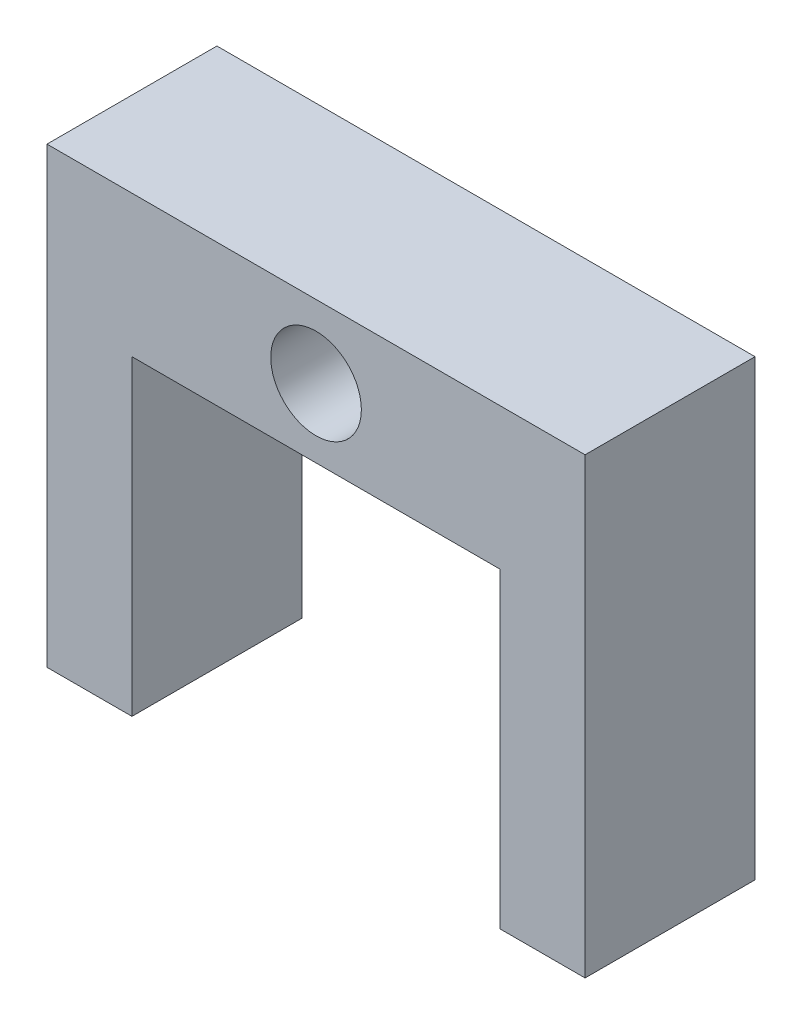
ISO-10303-21;
HEADER;
FILE_DESCRIPTION(('STEP AP214'),'2;1');
FILE_NAME('part.step','',(''),(''),'','','');
FILE_SCHEMA(('AUTOMOTIVE_DESIGN { 1 0 10303 214 1 1 1 1 }'));
ENDSEC;
DATA;
#1=APPLICATION_CONTEXT('core data for automotive mechanical design processes');
#2=APPLICATION_PROTOCOL_DEFINITION('international standard','automotive_design',2000,#1);
#3=PRODUCT_CONTEXT('',#1,'mechanical');
#4=PRODUCT('Part','Part','',(#3));
#5=PRODUCT_RELATED_PRODUCT_CATEGORY('part','',(#4));
#6=PRODUCT_DEFINITION_FORMATION('','',#4);
#7=PRODUCT_DEFINITION_CONTEXT('part definition',#1,'design');
#8=PRODUCT_DEFINITION('design','',#6,#7);
#9=PRODUCT_DEFINITION_SHAPE('','',#8);
#10=(LENGTH_UNIT() NAMED_UNIT(*) SI_UNIT(.MILLI.,.METRE.));
#11=(NAMED_UNIT(*) PLANE_ANGLE_UNIT() SI_UNIT($,.RADIAN.));
#12=(NAMED_UNIT(*) SI_UNIT($,.STERADIAN.) SOLID_ANGLE_UNIT());
#13=UNCERTAINTY_MEASURE_WITH_UNIT(LENGTH_MEASURE(1.E-05),#10,'distance_accuracy_value','');
#14=(GEOMETRIC_REPRESENTATION_CONTEXT(3) GLOBAL_UNCERTAINTY_ASSIGNED_CONTEXT((#13)) GLOBAL_UNIT_ASSIGNED_CONTEXT((#10,
#11,#12)) REPRESENTATION_CONTEXT('',''));
#15=CARTESIAN_POINT('',(0.,0.,0.));
#16=DIRECTION('',(0.,0.,1.));
#17=DIRECTION('',(1.,0.,0.));
#18=AXIS2_PLACEMENT_3D('',#15,#16,#17);
#19=CARTESIAN_POINT('',(0.,0.,6.));
#20=DIRECTION('',(0.,0.,-1.));
#21=DIRECTION('',(-1.,0.,0.));
#22=AXIS2_PLACEMENT_3D('',#19,#20,#21);
#23=PLANE('',#22);
#24=DIRECTION('',(0.,-1.,0.));
#25=VECTOR('',#24,1.);
#26=CARTESIAN_POINT('',(0.,0.,6.));
#27=LINE('',#26,#25);
#28=CARTESIAN_POINT('',(0.,16.,6.));
#29=VERTEX_POINT('',#28);
#30=CARTESIAN_POINT('',(0.,0.,6.));
#31=VERTEX_POINT('',#30);
#32=EDGE_CURVE('E147',#29,#31,#27,.T.);
#33=ORIENTED_EDGE('',*,*,#32,.T.);
#34=DIRECTION('',(1.,0.,0.));
#35=VECTOR('',#34,1.);
#36=CARTESIAN_POINT('',(0.,0.,6.));
#37=LINE('',#36,#35);
#38=CARTESIAN_POINT('',(3.,0.,6.));
#39=VERTEX_POINT('',#38);
#40=EDGE_CURVE('E95',#31,#39,#37,.T.);
#41=ORIENTED_EDGE('',*,*,#40,.T.);
#42=DIRECTION('',(0.,1.,0.));
#43=VECTOR('',#42,1.);
#44=CARTESIAN_POINT('',(3.,0.,6.));
#45=LINE('',#44,#43);
#46=CARTESIAN_POINT('',(3.,11.,6.));
#47=VERTEX_POINT('',#46);
#48=EDGE_CURVE('E162',#39,#47,#45,.T.);
#49=ORIENTED_EDGE('',*,*,#48,.T.);
#50=DIRECTION('',(1.,0.,0.));
#51=VECTOR('',#50,1.);
#52=CARTESIAN_POINT('',(3.,11.,6.));
#53=LINE('',#52,#51);
#54=CARTESIAN_POINT('',(16.,11.,6.));
#55=VERTEX_POINT('',#54);
#56=EDGE_CURVE('E175',#47,#55,#53,.T.);
#57=ORIENTED_EDGE('',*,*,#56,.T.);
#58=DIRECTION('',(0.,-1.,0.));
#59=VECTOR('',#58,1.);
#60=CARTESIAN_POINT('',(16.,0.,6.));
#61=LINE('',#60,#59);
#62=CARTESIAN_POINT('',(16.,0.,6.));
#63=VERTEX_POINT('',#62);
#64=EDGE_CURVE('E114',#55,#63,#61,.T.);
#65=ORIENTED_EDGE('',*,*,#64,.T.);
#66=DIRECTION('',(1.,0.,0.));
#67=VECTOR('',#66,1.);
#68=CARTESIAN_POINT('',(16.,0.,6.));
#69=LINE('',#68,#67);
#70=CARTESIAN_POINT('',(19.,0.,6.));
#71=VERTEX_POINT('',#70);
#72=EDGE_CURVE('E108',#63,#71,#69,.T.);
#73=ORIENTED_EDGE('',*,*,#72,.T.);
#74=DIRECTION('',(0.,1.,0.));
#75=VECTOR('',#74,1.);
#76=CARTESIAN_POINT('',(19.,0.,6.));
#77=LINE('',#76,#75);
#78=CARTESIAN_POINT('',(19.,16.,6.));
#79=VERTEX_POINT('',#78);
#80=EDGE_CURVE('E112',#71,#79,#77,.T.);
#81=ORIENTED_EDGE('',*,*,#80,.T.);
#82=DIRECTION('',(-1.,0.,0.));
#83=VECTOR('',#82,1.);
#84=CARTESIAN_POINT('',(0.,16.,6.));
#85=LINE('',#84,#83);
#86=EDGE_CURVE('E52',#79,#29,#85,.T.);
#87=ORIENTED_EDGE('',*,*,#86,.T.);
#88=EDGE_LOOP('',(#33,#41,#49,#57,#65,#73,#81,#87));
#89=FACE_BOUND('',#88,.T.);
#90=CARTESIAN_POINT('',(9.5,13.4307299658215,6.));
#91=DIRECTION('',(0.,0.,1.));
#92=DIRECTION('',(1.,0.,0.));
#93=AXIS2_PLACEMENT_3D('',#90,#91,#92);
#94=CIRCLE('',#93,1.6);
#95=CARTESIAN_POINT('',(11.1,13.4307299658215,6.));
#96=VERTEX_POINT('',#95);
#97=EDGE_CURVE('E136',#96,#96,#94,.T.);
#98=ORIENTED_EDGE('',*,*,#97,.F.);
#99=EDGE_LOOP('',(#98));
#100=FACE_BOUND('',#99,.T.);
#101=ADVANCED_FACE('F35',(#89,#100),#23,.F.);
#102=CARTESIAN_POINT('',(0.,0.,0.));
#103=DIRECTION('',(0.,0.,-1.));
#104=DIRECTION('',(-1.,0.,0.));
#105=AXIS2_PLACEMENT_3D('',#102,#103,#104);
#106=PLANE('',#105);
#107=DIRECTION('',(0.,-1.,0.));
#108=VECTOR('',#107,1.);
#109=CARTESIAN_POINT('',(0.,0.,0.));
#110=LINE('',#109,#108);
#111=CARTESIAN_POINT('',(0.,16.,0.));
#112=VERTEX_POINT('',#111);
#113=CARTESIAN_POINT('',(0.,0.,0.));
#114=VERTEX_POINT('',#113);
#115=EDGE_CURVE('E132',#112,#114,#110,.T.);
#116=ORIENTED_EDGE('',*,*,#115,.F.);
#117=DIRECTION('',(-1.,0.,0.));
#118=VECTOR('',#117,1.);
#119=CARTESIAN_POINT('',(0.,16.,0.));
#120=LINE('',#119,#118);
#121=CARTESIAN_POINT('',(19.,16.,0.));
#122=VERTEX_POINT('',#121);
#123=EDGE_CURVE('E87',#122,#112,#120,.T.);
#124=ORIENTED_EDGE('',*,*,#123,.F.);
#125=DIRECTION('',(0.,1.,0.));
#126=VECTOR('',#125,1.);
#127=CARTESIAN_POINT('',(19.,0.,0.));
#128=LINE('',#127,#126);
#129=CARTESIAN_POINT('',(19.,0.,0.));
#130=VERTEX_POINT('',#129);
#131=EDGE_CURVE('E81',#130,#122,#128,.T.);
#132=ORIENTED_EDGE('',*,*,#131,.F.);
#133=DIRECTION('',(1.,0.,0.));
#134=VECTOR('',#133,1.);
#135=CARTESIAN_POINT('',(16.,0.,0.));
#136=LINE('',#135,#134);
#137=CARTESIAN_POINT('',(16.,0.,0.));
#138=VERTEX_POINT('',#137);
#139=EDGE_CURVE('E122',#138,#130,#136,.T.);
#140=ORIENTED_EDGE('',*,*,#139,.F.);
#141=DIRECTION('',(0.,-1.,0.));
#142=VECTOR('',#141,1.);
#143=CARTESIAN_POINT('',(16.,0.,0.));
#144=LINE('',#143,#142);
#145=CARTESIAN_POINT('',(16.,11.,0.));
#146=VERTEX_POINT('',#145);
#147=EDGE_CURVE('E142',#146,#138,#144,.T.);
#148=ORIENTED_EDGE('',*,*,#147,.F.);
#149=DIRECTION('',(1.,0.,0.));
#150=VECTOR('',#149,1.);
#151=CARTESIAN_POINT('',(3.,11.,0.));
#152=LINE('',#151,#150);
#153=CARTESIAN_POINT('',(3.,11.,0.));
#154=VERTEX_POINT('',#153);
#155=EDGE_CURVE('E140',#154,#146,#152,.T.);
#156=ORIENTED_EDGE('',*,*,#155,.F.);
#157=DIRECTION('',(0.,1.,0.));
#158=VECTOR('',#157,1.);
#159=CARTESIAN_POINT('',(3.,0.,0.));
#160=LINE('',#159,#158);
#161=CARTESIAN_POINT('',(3.,0.,0.));
#162=VERTEX_POINT('',#161);
#163=EDGE_CURVE('E138',#162,#154,#160,.T.);
#164=ORIENTED_EDGE('',*,*,#163,.F.);
#165=DIRECTION('',(1.,0.,0.));
#166=VECTOR('',#165,1.);
#167=CARTESIAN_POINT('',(0.,0.,0.));
#168=LINE('',#167,#166);
#169=EDGE_CURVE('E135',#114,#162,#168,.T.);
#170=ORIENTED_EDGE('',*,*,#169,.F.);
#171=EDGE_LOOP('',(#116,#124,#132,#140,#148,#156,#164,#170));
#172=FACE_BOUND('',#171,.T.);
#173=CARTESIAN_POINT('',(9.5,13.4307299658215,0.));
#174=DIRECTION('',(0.,0.,1.));
#175=DIRECTION('',(1.,0.,0.));
#176=AXIS2_PLACEMENT_3D('',#173,#174,#175);
#177=CIRCLE('',#176,1.6);
#178=CARTESIAN_POINT('',(11.1,13.4307299658215,0.));
#179=VERTEX_POINT('',#178);
#180=EDGE_CURVE('E181',#179,#179,#177,.T.);
#181=ORIENTED_EDGE('',*,*,#180,.T.);
#182=EDGE_LOOP('',(#181));
#183=FACE_BOUND('',#182,.T.);
#184=ADVANCED_FACE('F166',(#172,#183),#106,.T.);
#185=CARTESIAN_POINT('',(0.,0.,6.));
#186=DIRECTION('',(1.,0.,0.));
#187=DIRECTION('',(0.,0.,-1.));
#188=AXIS2_PLACEMENT_3D('',#185,#186,#187);
#189=PLANE('',#188);
#190=ORIENTED_EDGE('',*,*,#115,.T.);
#191=DIRECTION('',(0.,0.,-1.));
#192=VECTOR('',#191,1.);
#193=CARTESIAN_POINT('',(0.,0.,6.));
#194=LINE('',#193,#192);
#195=EDGE_CURVE('E11',#31,#114,#194,.T.);
#196=ORIENTED_EDGE('',*,*,#195,.F.);
#197=ORIENTED_EDGE('',*,*,#32,.F.);
#198=DIRECTION('',(0.,0.,-1.));
#199=VECTOR('',#198,1.);
#200=CARTESIAN_POINT('',(0.,16.,6.));
#201=LINE('',#200,#199);
#202=EDGE_CURVE('E128',#29,#112,#201,.T.);
#203=ORIENTED_EDGE('',*,*,#202,.T.);
#204=EDGE_LOOP('',(#190,#196,#197,#203));
#205=FACE_BOUND('',#204,.T.);
#206=ADVANCED_FACE('F37',(#205),#189,.F.);
#207=CARTESIAN_POINT('',(0.,0.,6.));
#208=DIRECTION('',(0.,1.,0.));
#209=DIRECTION('',(-1.,0.,0.));
#210=AXIS2_PLACEMENT_3D('',#207,#208,#209);
#211=PLANE('',#210);
#212=ORIENTED_EDGE('',*,*,#169,.T.);
#213=DIRECTION('',(0.,0.,-1.));
#214=VECTOR('',#213,1.);
#215=CARTESIAN_POINT('',(3.,0.,6.));
#216=LINE('',#215,#214);
#217=EDGE_CURVE('E44',#39,#162,#216,.T.);
#218=ORIENTED_EDGE('',*,*,#217,.F.);
#219=ORIENTED_EDGE('',*,*,#40,.F.);
#220=ORIENTED_EDGE('',*,*,#195,.T.);
#221=EDGE_LOOP('',(#212,#218,#219,#220));
#222=FACE_BOUND('',#221,.T.);
#223=ADVANCED_FACE('F209',(#222),#211,.F.);
#224=CARTESIAN_POINT('',(3.,0.,6.));
#225=DIRECTION('',(-1.,0.,0.));
#226=DIRECTION('',(0.,-1.,0.));
#227=AXIS2_PLACEMENT_3D('',#224,#225,#226);
#228=PLANE('',#227);
#229=ORIENTED_EDGE('',*,*,#163,.T.);
#230=DIRECTION('',(0.,0.,-1.));
#231=VECTOR('',#230,1.);
#232=CARTESIAN_POINT('',(3.,11.,6.));
#233=LINE('',#232,#231);
#234=EDGE_CURVE('E154',#47,#154,#233,.T.);
#235=ORIENTED_EDGE('',*,*,#234,.F.);
#236=ORIENTED_EDGE('',*,*,#48,.F.);
#237=ORIENTED_EDGE('',*,*,#217,.T.);
#238=EDGE_LOOP('',(#229,#235,#236,#237));
#239=FACE_BOUND('',#238,.T.);
#240=ADVANCED_FACE('F160',(#239),#228,.F.);
#241=CARTESIAN_POINT('',(3.,11.,6.));
#242=DIRECTION('',(0.,1.,0.));
#243=DIRECTION('',(-1.,0.,0.));
#244=AXIS2_PLACEMENT_3D('',#241,#242,#243);
#245=PLANE('',#244);
#246=ORIENTED_EDGE('',*,*,#155,.T.);
#247=DIRECTION('',(0.,0.,-1.));
#248=VECTOR('',#247,1.);
#249=CARTESIAN_POINT('',(16.,11.,6.));
#250=LINE('',#249,#248);
#251=EDGE_CURVE('E151',#55,#146,#250,.T.);
#252=ORIENTED_EDGE('',*,*,#251,.F.);
#253=ORIENTED_EDGE('',*,*,#56,.F.);
#254=ORIENTED_EDGE('',*,*,#234,.T.);
#255=EDGE_LOOP('',(#246,#252,#253,#254));
#256=FACE_BOUND('',#255,.T.);
#257=ADVANCED_FACE('F171',(#256),#245,.F.);
#258=CARTESIAN_POINT('',(16.,0.,6.));
#259=DIRECTION('',(1.,0.,0.));
#260=DIRECTION('',(0.,0.,-1.));
#261=AXIS2_PLACEMENT_3D('',#258,#259,#260);
#262=PLANE('',#261);
#263=ORIENTED_EDGE('',*,*,#147,.T.);
#264=DIRECTION('',(0.,0.,-1.));
#265=VECTOR('',#264,1.);
#266=CARTESIAN_POINT('',(16.,0.,6.));
#267=LINE('',#266,#265);
#268=EDGE_CURVE('E123',#63,#138,#267,.T.);
#269=ORIENTED_EDGE('',*,*,#268,.F.);
#270=ORIENTED_EDGE('',*,*,#64,.F.);
#271=ORIENTED_EDGE('',*,*,#251,.T.);
#272=EDGE_LOOP('',(#263,#269,#270,#271));
#273=FACE_BOUND('',#272,.T.);
#274=ADVANCED_FACE('F174',(#273),#262,.F.);
#275=CARTESIAN_POINT('',(16.,0.,6.));
#276=DIRECTION('',(0.,1.,0.));
#277=DIRECTION('',(0.,0.,1.));
#278=AXIS2_PLACEMENT_3D('',#275,#276,#277);
#279=PLANE('',#278);
#280=ORIENTED_EDGE('',*,*,#139,.T.);
#281=DIRECTION('',(0.,0.,-1.));
#282=VECTOR('',#281,1.);
#283=CARTESIAN_POINT('',(19.,0.,6.));
#284=LINE('',#283,#282);
#285=EDGE_CURVE('E119',#71,#130,#284,.T.);
#286=ORIENTED_EDGE('',*,*,#285,.F.);
#287=ORIENTED_EDGE('',*,*,#72,.F.);
#288=ORIENTED_EDGE('',*,*,#268,.T.);
#289=EDGE_LOOP('',(#280,#286,#287,#288));
#290=FACE_BOUND('',#289,.T.);
#291=ADVANCED_FACE('F120',(#290),#279,.F.);
#292=CARTESIAN_POINT('',(19.,0.,6.));
#293=DIRECTION('',(-1.,0.,0.));
#294=DIRECTION('',(0.,0.,1.));
#295=AXIS2_PLACEMENT_3D('',#292,#293,#294);
#296=PLANE('',#295);
#297=ORIENTED_EDGE('',*,*,#131,.T.);
#298=DIRECTION('',(0.,0.,-1.));
#299=VECTOR('',#298,1.);
#300=CARTESIAN_POINT('',(19.,16.,6.));
#301=LINE('',#300,#299);
#302=EDGE_CURVE('E124',#79,#122,#301,.T.);
#303=ORIENTED_EDGE('',*,*,#302,.F.);
#304=ORIENTED_EDGE('',*,*,#80,.F.);
#305=ORIENTED_EDGE('',*,*,#285,.T.);
#306=EDGE_LOOP('',(#297,#303,#304,#305));
#307=FACE_BOUND('',#306,.T.);
#308=ADVANCED_FACE('F126',(#307),#296,.F.);
#309=CARTESIAN_POINT('',(0.,16.,6.));
#310=DIRECTION('',(0.,-1.,0.));
#311=DIRECTION('',(0.,0.,-1.));
#312=AXIS2_PLACEMENT_3D('',#309,#310,#311);
#313=PLANE('',#312);
#314=ORIENTED_EDGE('',*,*,#123,.T.);
#315=ORIENTED_EDGE('',*,*,#202,.F.);
#316=ORIENTED_EDGE('',*,*,#86,.F.);
#317=ORIENTED_EDGE('',*,*,#302,.T.);
#318=EDGE_LOOP('',(#314,#315,#316,#317));
#319=FACE_BOUND('',#318,.T.);
#320=ADVANCED_FACE('F197',(#319),#313,.F.);
#321=CARTESIAN_POINT('',(9.5,13.4307299658215,6.));
#322=DIRECTION('',(0.,0.,-1.));
#323=DIRECTION('',(-1.,0.,0.));
#324=AXIS2_PLACEMENT_3D('',#321,#322,#323);
#325=CYLINDRICAL_SURFACE('',#324,1.6);
#326=ORIENTED_EDGE('',*,*,#97,.T.);
#327=EDGE_LOOP('',(#326));
#328=FACE_BOUND('',#327,.T.);
#329=ORIENTED_EDGE('',*,*,#180,.F.);
#330=EDGE_LOOP('',(#329));
#331=FACE_BOUND('',#330,.T.);
#332=ADVANCED_FACE('F187',(#328,#331),#325,.F.);
#333=CLOSED_SHELL('',(#101,#184,#206,#223,#240,#257,#274,#291,#308,#320,#332));
#334=MANIFOLD_SOLID_BREP('B2',#333);
#335=ADVANCED_BREP_SHAPE_REPRESENTATION('',(#18,#334),#14);
#336=SHAPE_DEFINITION_REPRESENTATION(#9,#335);
ENDSEC;
END-ISO-10303-21;
